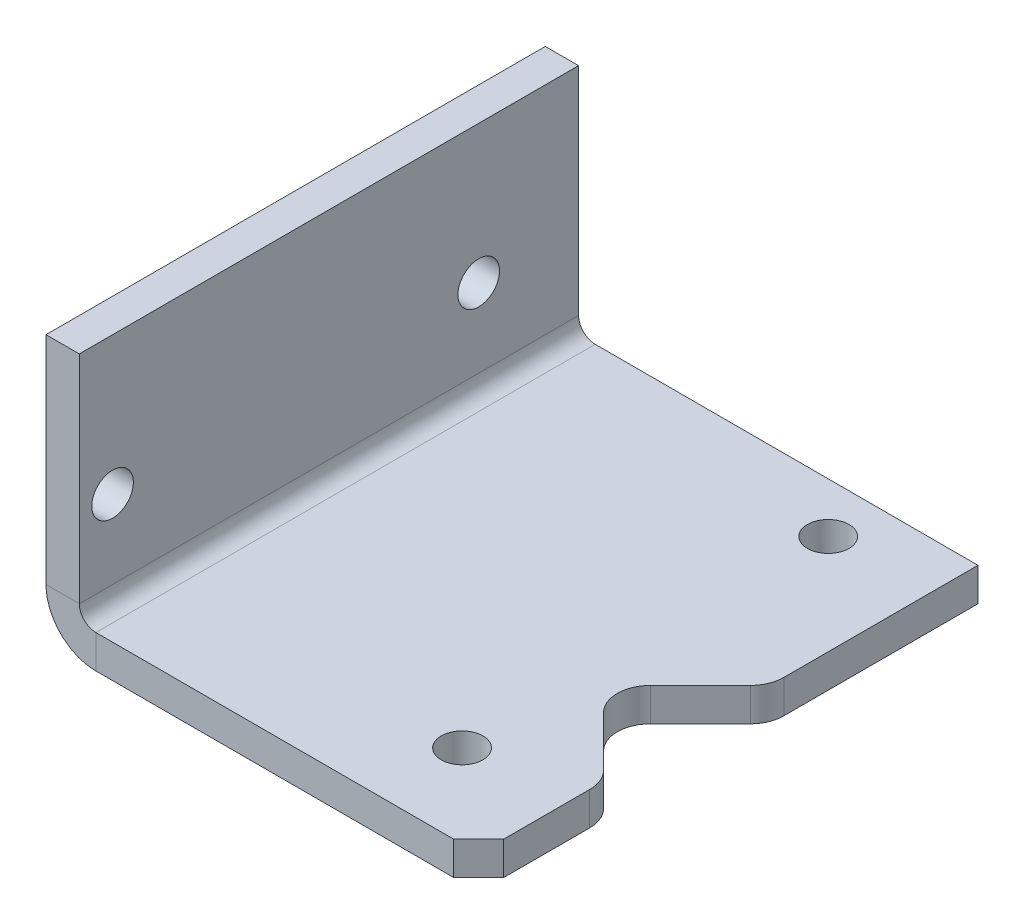
ISO-10303-21;
HEADER;
FILE_DESCRIPTION(('STEP AP214'),'2;1');
FILE_NAME('part.step','',(''),(''),'','','');
FILE_SCHEMA(('AUTOMOTIVE_DESIGN { 1 0 10303 214 1 1 1 1 }'));
ENDSEC;
DATA;
#1=APPLICATION_CONTEXT('core data for automotive mechanical design processes');
#2=APPLICATION_PROTOCOL_DEFINITION('international standard','automotive_design',2000,#1);
#3=PRODUCT_CONTEXT('',#1,'mechanical');
#4=PRODUCT('Part','Part','',(#3));
#5=PRODUCT_RELATED_PRODUCT_CATEGORY('part','',(#4));
#6=PRODUCT_DEFINITION_FORMATION('','',#4);
#7=PRODUCT_DEFINITION_CONTEXT('part definition',#1,'design');
#8=PRODUCT_DEFINITION('design','',#6,#7);
#9=PRODUCT_DEFINITION_SHAPE('','',#8);
#10=(LENGTH_UNIT() NAMED_UNIT(*) SI_UNIT(.MILLI.,.METRE.));
#11=(NAMED_UNIT(*) PLANE_ANGLE_UNIT() SI_UNIT($,.RADIAN.));
#12=(NAMED_UNIT(*) SI_UNIT($,.STERADIAN.) SOLID_ANGLE_UNIT());
#13=UNCERTAINTY_MEASURE_WITH_UNIT(LENGTH_MEASURE(1.E-05),#10,'distance_accuracy_value','');
#14=(GEOMETRIC_REPRESENTATION_CONTEXT(3) GLOBAL_UNCERTAINTY_ASSIGNED_CONTEXT((#13)) GLOBAL_UNIT_ASSIGNED_CONTEXT((#10,
#11,#12)) REPRESENTATION_CONTEXT('',''));
#15=CARTESIAN_POINT('',(0.,0.,0.));
#16=DIRECTION('',(0.,0.,1.));
#17=DIRECTION('',(1.,0.,0.));
#18=AXIS2_PLACEMENT_3D('',#15,#16,#17);
#19=CARTESIAN_POINT('',(0.,-9.,0.));
#20=DIRECTION('',(0.,1.,0.));
#21=DIRECTION('',(-1.,0.,0.));
#22=AXIS2_PLACEMENT_3D('',#19,#20,#21);
#23=PLANE('',#22);
#24=CARTESIAN_POINT('',(17.9999999999999,-9.00000000000007,10.));
#25=DIRECTION('',(0.,1.,0.));
#26=DIRECTION('',(-1.,0.,0.));
#27=AXIS2_PLACEMENT_3D('',#24,#25,#26);
#28=CIRCLE('',#27,1.25);
#29=CARTESIAN_POINT('',(16.7499999999999,-9.00000000000006,10.));
#30=VERTEX_POINT('',#29);
#31=EDGE_CURVE('E180',#30,#30,#28,.F.);
#32=ORIENTED_EDGE('',*,*,#31,.F.);
#33=EDGE_LOOP('',(#32));
#34=FACE_BOUND('',#33,.T.);
#35=CARTESIAN_POINT('',(17.9999999999999,-9.00000000000006,-12.));
#36=DIRECTION('',(0.,1.,0.));
#37=DIRECTION('',(-1.,0.,0.));
#38=AXIS2_PLACEMENT_3D('',#35,#36,#37);
#39=CIRCLE('',#38,1.25);
#40=CARTESIAN_POINT('',(16.7499999999999,-9.00000000000006,-12.));
#41=VERTEX_POINT('',#40);
#42=EDGE_CURVE('E169',#41,#41,#39,.F.);
#43=ORIENTED_EDGE('',*,*,#42,.F.);
#44=EDGE_LOOP('',(#43));
#45=FACE_BOUND('',#44,.T.);
#46=DIRECTION('',(0.,0.,1.));
#47=VECTOR('',#46,1.);
#48=CARTESIAN_POINT('',(24.,-9.00000000000009,15.));
#49=LINE('',#48,#47);
#50=CARTESIAN_POINT('',(24.,-9.00000000000008,-15.));
#51=VERTEX_POINT('',#50);
#52=CARTESIAN_POINT('',(24.,-9.00000000000008,-3.32842712474621));
#53=VERTEX_POINT('',#52);
#54=EDGE_CURVE('E211',#51,#53,#49,.T.);
#55=ORIENTED_EDGE('',*,*,#54,.T.);
#56=CARTESIAN_POINT('',(22.,-9.00000000000008,-3.32842712474621));
#57=DIRECTION('',(0.,1.,0.));
#58=DIRECTION('',(-1.,0.,0.));
#59=AXIS2_PLACEMENT_3D('',#56,#57,#58);
#60=CIRCLE('',#59,2.);
#61=CARTESIAN_POINT('',(23.4142135623731,-9.00000000000008,-1.91421356237312));
#62=VERTEX_POINT('',#61);
#63=EDGE_CURVE('E289',#53,#62,#60,.F.);
#64=ORIENTED_EDGE('',*,*,#63,.T.);
#65=DIRECTION('',(-0.707106781186546,0.,0.707106781186549));
#66=VECTOR('',#65,1.);
#67=CARTESIAN_POINT('',(10.75,-9.00000000000004,10.75));
#68=LINE('',#67,#66);
#69=CARTESIAN_POINT('',(20.4142135623731,-9.00000000000007,1.08578643762689));
#70=VERTEX_POINT('',#69);
#71=EDGE_CURVE('E332',#62,#70,#68,.T.);
#72=ORIENTED_EDGE('',*,*,#71,.T.);
#73=CARTESIAN_POINT('',(21.8284271247462,-9.00000000000008,2.49999999999997));
#74=DIRECTION('',(0.,1.,0.));
#75=DIRECTION('',(-1.,0.,0.));
#76=AXIS2_PLACEMENT_3D('',#73,#74,#75);
#77=CIRCLE('',#76,2.);
#78=CARTESIAN_POINT('',(20.4142135623731,-9.00000000000007,3.91421356237309));
#79=VERTEX_POINT('',#78);
#80=EDGE_CURVE('E335',#79,#70,#77,.F.);
#81=ORIENTED_EDGE('',*,*,#80,.F.);
#82=DIRECTION('',(-0.707106781186557,0.,-0.707106781186538));
#83=VECTOR('',#82,1.);
#84=CARTESIAN_POINT('',(8.24999999999974,-9.00000000000003,-8.24999999999998));
#85=LINE('',#84,#83);
#86=CARTESIAN_POINT('',(23.4142135623731,-9.00000000000008,6.91421356237296));
#87=VERTEX_POINT('',#86);
#88=EDGE_CURVE('E163',#87,#79,#85,.T.);
#89=ORIENTED_EDGE('',*,*,#88,.F.);
#90=CARTESIAN_POINT('',(22.,-9.00000000000008,8.32842712474607));
#91=DIRECTION('',(0.,1.,0.));
#92=DIRECTION('',(-1.,0.,0.));
#93=AXIS2_PLACEMENT_3D('',#90,#91,#92);
#94=CIRCLE('',#93,2.);
#95=CARTESIAN_POINT('',(24.,-9.00000000000009,8.32842712474607));
#96=VERTEX_POINT('',#95);
#97=EDGE_CURVE('E54',#87,#96,#94,.F.);
#98=ORIENTED_EDGE('',*,*,#97,.T.);
#99=CARTESIAN_POINT('',(24.,-9.00000000000009,13.5));
#100=VERTEX_POINT('',#99);
#101=EDGE_CURVE('E209',#96,#100,#49,.T.);
#102=ORIENTED_EDGE('',*,*,#101,.T.);
#103=DIRECTION('',(0.707106781186546,0.,-0.707106781186549));
#104=VECTOR('',#103,1.);
#105=CARTESIAN_POINT('',(22.5,-9.00000000000008,15.));
#106=LINE('',#105,#104);
#107=CARTESIAN_POINT('',(22.5,-9.00000000000008,15.));
#108=VERTEX_POINT('',#107);
#109=EDGE_CURVE('E278',#100,#108,#106,.F.);
#110=ORIENTED_EDGE('',*,*,#109,.T.);
#111=DIRECTION('',(-1.,0.,0.));
#112=VECTOR('',#111,1.);
#113=CARTESIAN_POINT('',(0.,-9.,15.));
#114=LINE('',#113,#112);
#115=CARTESIAN_POINT('',(0.99999999999999,-9.00000000000001,15.));
#116=VERTEX_POINT('',#115);
#117=EDGE_CURVE('E214',#108,#116,#114,.T.);
#118=ORIENTED_EDGE('',*,*,#117,.T.);
#119=DIRECTION('',(0.,0.,1.));
#120=VECTOR('',#119,1.);
#121=CARTESIAN_POINT('',(0.99999999999999,-9.00000000000001,0.));
#122=LINE('',#121,#120);
#123=CARTESIAN_POINT('',(0.999999999999991,-9.00000000000001,-15.));
#124=VERTEX_POINT('',#123);
#125=EDGE_CURVE('E201',#124,#116,#122,.T.);
#126=ORIENTED_EDGE('',*,*,#125,.F.);
#127=DIRECTION('',(1.,0.,0.));
#128=VECTOR('',#127,1.);
#129=CARTESIAN_POINT('',(24.,-9.00000000000008,-15.));
#130=LINE('',#129,#128);
#131=EDGE_CURVE('E207',#124,#51,#130,.T.);
#132=ORIENTED_EDGE('',*,*,#131,.T.);
#133=EDGE_LOOP('',(#55,#64,#72,#81,#89,#98,#102,#110,#118,#126,#132));
#134=FACE_BOUND('',#133,.T.);
#135=ADVANCED_FACE('F39',(#34,#45,#134),#23,.F.);
#136=CARTESIAN_POINT('',(0.,-7.,0.));
#137=DIRECTION('',(0.,1.,0.));
#138=DIRECTION('',(-1.,0.,0.));
#139=AXIS2_PLACEMENT_3D('',#136,#137,#138);
#140=PLANE('',#139);
#141=CARTESIAN_POINT('',(18.,-7.00000000000006,-12.));
#142=DIRECTION('',(0.,1.,0.));
#143=DIRECTION('',(-1.,0.,0.));
#144=AXIS2_PLACEMENT_3D('',#141,#142,#143);
#145=CIRCLE('',#144,1.25);
#146=CARTESIAN_POINT('',(16.75,-7.00000000000006,-12.));
#147=VERTEX_POINT('',#146);
#148=EDGE_CURVE('E166',#147,#147,#145,.T.);
#149=ORIENTED_EDGE('',*,*,#148,.F.);
#150=EDGE_LOOP('',(#149));
#151=FACE_BOUND('',#150,.T.);
#152=CARTESIAN_POINT('',(18.,-7.00000000000006,10.));
#153=DIRECTION('',(0.,1.,0.));
#154=DIRECTION('',(-1.,0.,0.));
#155=AXIS2_PLACEMENT_3D('',#152,#153,#154);
#156=CIRCLE('',#155,1.25);
#157=CARTESIAN_POINT('',(16.75,-7.00000000000006,10.));
#158=VERTEX_POINT('',#157);
#159=EDGE_CURVE('E177',#158,#158,#156,.T.);
#160=ORIENTED_EDGE('',*,*,#159,.F.);
#161=EDGE_LOOP('',(#160));
#162=FACE_BOUND('',#161,.T.);
#163=DIRECTION('',(-0.707106781186546,0.,0.707106781186549));
#164=VECTOR('',#163,1.);
#165=CARTESIAN_POINT('',(10.75,-7.00000000000004,10.75));
#166=LINE('',#165,#164);
#167=CARTESIAN_POINT('',(23.4142135623731,-7.00000000000008,-1.91421356237312));
#168=VERTEX_POINT('',#167);
#169=CARTESIAN_POINT('',(20.4142135623731,-7.00000000000007,1.08578643762689));
#170=VERTEX_POINT('',#169);
#171=EDGE_CURVE('E153',#168,#170,#166,.T.);
#172=ORIENTED_EDGE('',*,*,#171,.F.);
#173=CARTESIAN_POINT('',(22.,-7.00000000000008,-3.32842712474621));
#174=DIRECTION('',(0.,1.,0.));
#175=DIRECTION('',(-1.,0.,0.));
#176=AXIS2_PLACEMENT_3D('',#173,#174,#175);
#177=CIRCLE('',#176,2.);
#178=CARTESIAN_POINT('',(24.,-7.00000000000008,-3.32842712474621));
#179=VERTEX_POINT('',#178);
#180=EDGE_CURVE('E284',#168,#179,#177,.T.);
#181=ORIENTED_EDGE('',*,*,#180,.T.);
#182=DIRECTION('',(0.,0.,1.));
#183=VECTOR('',#182,1.);
#184=CARTESIAN_POINT('',(24.,-7.00000000000009,15.));
#185=LINE('',#184,#183);
#186=CARTESIAN_POINT('',(24.,-7.00000000000008,-15.));
#187=VERTEX_POINT('',#186);
#188=EDGE_CURVE('E219',#187,#179,#185,.T.);
#189=ORIENTED_EDGE('',*,*,#188,.F.);
#190=DIRECTION('',(1.,0.,0.));
#191=VECTOR('',#190,1.);
#192=CARTESIAN_POINT('',(24.,-7.00000000000008,-15.));
#193=LINE('',#192,#191);
#194=CARTESIAN_POINT('',(0.999999999999997,-7.00000000000001,-15.));
#195=VERTEX_POINT('',#194);
#196=EDGE_CURVE('E206',#195,#187,#193,.T.);
#197=ORIENTED_EDGE('',*,*,#196,.F.);
#198=DIRECTION('',(0.,0.,-1.));
#199=VECTOR('',#198,1.);
#200=CARTESIAN_POINT('',(0.999999999999997,-7.00000000000001,15.));
#201=LINE('',#200,#199);
#202=CARTESIAN_POINT('',(0.999999999999997,-7.00000000000001,15.));
#203=VERTEX_POINT('',#202);
#204=EDGE_CURVE('E196',#203,#195,#201,.T.);
#205=ORIENTED_EDGE('',*,*,#204,.F.);
#206=DIRECTION('',(-1.,0.,0.));
#207=VECTOR('',#206,1.);
#208=CARTESIAN_POINT('',(0.,-7.,15.));
#209=LINE('',#208,#207);
#210=CARTESIAN_POINT('',(22.5,-7.00000000000008,15.));
#211=VERTEX_POINT('',#210);
#212=EDGE_CURVE('E210',#211,#203,#209,.T.);
#213=ORIENTED_EDGE('',*,*,#212,.F.);
#214=DIRECTION('',(-0.707106781186546,0.,0.707106781186549));
#215=VECTOR('',#214,1.);
#216=CARTESIAN_POINT('',(18.75,-7.00000000000007,18.75));
#217=LINE('',#216,#215);
#218=CARTESIAN_POINT('',(24.,-7.00000000000009,13.5));
#219=VERTEX_POINT('',#218);
#220=EDGE_CURVE('E272',#211,#219,#217,.F.);
#221=ORIENTED_EDGE('',*,*,#220,.T.);
#222=CARTESIAN_POINT('',(24.,-7.00000000000009,8.32842712474607));
#223=VERTEX_POINT('',#222);
#224=EDGE_CURVE('E218',#223,#219,#185,.T.);
#225=ORIENTED_EDGE('',*,*,#224,.F.);
#226=CARTESIAN_POINT('',(22.,-7.00000000000008,8.32842712474607));
#227=DIRECTION('',(0.,1.,0.));
#228=DIRECTION('',(-1.,0.,0.));
#229=AXIS2_PLACEMENT_3D('',#226,#227,#228);
#230=CIRCLE('',#229,2.);
#231=CARTESIAN_POINT('',(23.4142135623731,-7.00000000000008,6.91421356237296));
#232=VERTEX_POINT('',#231);
#233=EDGE_CURVE('E150',#223,#232,#230,.T.);
#234=ORIENTED_EDGE('',*,*,#233,.T.);
#235=DIRECTION('',(-0.707106781186557,0.,-0.707106781186538));
#236=VECTOR('',#235,1.);
#237=CARTESIAN_POINT('',(8.24999999999975,-7.00000000000003,-8.24999999999998));
#238=LINE('',#237,#236);
#239=CARTESIAN_POINT('',(20.4142135623731,-7.00000000000007,3.91421356237309));
#240=VERTEX_POINT('',#239);
#241=EDGE_CURVE('E144',#232,#240,#238,.T.);
#242=ORIENTED_EDGE('',*,*,#241,.T.);
#243=CARTESIAN_POINT('',(21.8284271247462,-7.00000000000008,2.49999999999997));
#244=DIRECTION('',(0.,1.,0.));
#245=DIRECTION('',(-1.,0.,0.));
#246=AXIS2_PLACEMENT_3D('',#243,#244,#245);
#247=CIRCLE('',#246,2.);
#248=EDGE_CURVE('E148',#240,#170,#247,.F.);
#249=ORIENTED_EDGE('',*,*,#248,.T.);
#250=EDGE_LOOP('',(#172,#181,#189,#197,#205,#213,#221,#225,#234,#242,#249));
#251=FACE_BOUND('',#250,.T.);
#252=ADVANCED_FACE('F147',(#151,#162,#251),#140,.T.);
#253=CARTESIAN_POINT('',(24.,-9.00000000000009,15.));
#254=DIRECTION('',(-1.,0.,0.));
#255=DIRECTION('',(0.,-1.,0.));
#256=AXIS2_PLACEMENT_3D('',#253,#254,#255);
#257=PLANE('',#256);
#258=ORIENTED_EDGE('',*,*,#101,.F.);
#259=DIRECTION('',(0.,1.,0.));
#260=VECTOR('',#259,1.);
#261=CARTESIAN_POINT('',(24.,-7.00000000000009,8.32842712474607));
#262=LINE('',#261,#260);
#263=EDGE_CURVE('E47',#96,#223,#262,.T.);
#264=ORIENTED_EDGE('',*,*,#263,.T.);
#265=ORIENTED_EDGE('',*,*,#224,.T.);
#266=DIRECTION('',(0.,-1.,0.));
#267=VECTOR('',#266,1.);
#268=CARTESIAN_POINT('',(24.,-9.00000000000009,13.5));
#269=LINE('',#268,#267);
#270=EDGE_CURVE('E275',#219,#100,#269,.T.);
#271=ORIENTED_EDGE('',*,*,#270,.T.);
#272=EDGE_LOOP('',(#258,#264,#265,#271));
#273=FACE_BOUND('',#272,.T.);
#274=ADVANCED_FACE('F293',(#273),#257,.F.);
#275=ORIENTED_EDGE('',*,*,#188,.T.);
#276=DIRECTION('',(0.,-1.,0.));
#277=VECTOR('',#276,1.);
#278=CARTESIAN_POINT('',(24.,-9.00000000000008,-3.32842712474621));
#279=LINE('',#278,#277);
#280=EDGE_CURVE('E286',#179,#53,#279,.T.);
#281=ORIENTED_EDGE('',*,*,#280,.T.);
#282=ORIENTED_EDGE('',*,*,#54,.F.);
#283=DIRECTION('',(0.,1.,0.));
#284=VECTOR('',#283,1.);
#285=CARTESIAN_POINT('',(24.,-9.00000000000008,-15.));
#286=LINE('',#285,#284);
#287=EDGE_CURVE('E216',#51,#187,#286,.T.);
#288=ORIENTED_EDGE('',*,*,#287,.T.);
#289=EDGE_LOOP('',(#275,#281,#282,#288));
#290=FACE_BOUND('',#289,.T.);
#291=ADVANCED_FACE('F323',(#290),#257,.F.);
#292=CARTESIAN_POINT('',(-2.,-7.,-15.));
#293=DIRECTION('',(0.,0.,-1.));
#294=DIRECTION('',(-1.,0.,0.));
#295=AXIS2_PLACEMENT_3D('',#292,#293,#294);
#296=PLANE('',#295);
#297=DIRECTION('',(0.,1.,0.));
#298=VECTOR('',#297,1.);
#299=CARTESIAN_POINT('',(0.,-7.,-15.));
#300=LINE('',#299,#298);
#301=CARTESIAN_POINT('',(0.,-6.,-15.));
#302=VERTEX_POINT('',#301);
#303=CARTESIAN_POINT('',(0.,7.,-15.));
#304=VERTEX_POINT('',#303);
#305=EDGE_CURVE('E261',#302,#304,#300,.T.);
#306=ORIENTED_EDGE('',*,*,#305,.F.);
#307=DIRECTION('',(-1.,0.,0.));
#308=VECTOR('',#307,1.);
#309=CARTESIAN_POINT('',(0.,-6.,-15.));
#310=LINE('',#309,#308);
#311=CARTESIAN_POINT('',(-2.,-6.,-15.));
#312=VERTEX_POINT('',#311);
#313=EDGE_CURVE('E232',#302,#312,#310,.T.);
#314=ORIENTED_EDGE('',*,*,#313,.T.);
#315=DIRECTION('',(0.,1.,0.));
#316=VECTOR('',#315,1.);
#317=CARTESIAN_POINT('',(-2.,-7.,-15.));
#318=LINE('',#317,#316);
#319=CARTESIAN_POINT('',(-2.,7.,-15.));
#320=VERTEX_POINT('',#319);
#321=EDGE_CURVE('E252',#312,#320,#318,.T.);
#322=ORIENTED_EDGE('',*,*,#321,.T.);
#323=DIRECTION('',(1.,0.,0.));
#324=VECTOR('',#323,1.);
#325=CARTESIAN_POINT('',(-2.,7.,-15.));
#326=LINE('',#325,#324);
#327=EDGE_CURVE('E258',#320,#304,#326,.T.);
#328=ORIENTED_EDGE('',*,*,#327,.T.);
#329=EDGE_LOOP('',(#306,#314,#322,#328));
#330=FACE_BOUND('',#329,.T.);
#331=ADVANCED_FACE('F378',(#330),#296,.T.);
#332=CARTESIAN_POINT('',(-2.,0.,0.));
#333=DIRECTION('',(1.,0.,0.));
#334=DIRECTION('',(0.,0.,-1.));
#335=AXIS2_PLACEMENT_3D('',#332,#333,#334);
#336=PLANE('',#335);
#337=CARTESIAN_POINT('',(-2.,-1.3,-9.00000000000001));
#338=DIRECTION('',(1.,0.,0.));
#339=DIRECTION('',(0.,0.,-1.));
#340=AXIS2_PLACEMENT_3D('',#337,#338,#339);
#341=CIRCLE('',#340,1.25);
#342=CARTESIAN_POINT('',(-2.,-1.3,-10.25));
#343=VERTEX_POINT('',#342);
#344=EDGE_CURVE('E186',#343,#343,#341,.F.);
#345=ORIENTED_EDGE('',*,*,#344,.F.);
#346=EDGE_LOOP('',(#345));
#347=FACE_BOUND('',#346,.T.);
#348=CARTESIAN_POINT('',(-2.,-1.3,13.));
#349=DIRECTION('',(1.,0.,0.));
#350=DIRECTION('',(0.,0.,-1.));
#351=AXIS2_PLACEMENT_3D('',#348,#349,#350);
#352=CIRCLE('',#351,1.25);
#353=CARTESIAN_POINT('',(-2.,-1.3,11.75));
#354=VERTEX_POINT('',#353);
#355=EDGE_CURVE('E192',#354,#354,#352,.F.);
#356=ORIENTED_EDGE('',*,*,#355,.F.);
#357=EDGE_LOOP('',(#356));
#358=FACE_BOUND('',#357,.T.);
#359=DIRECTION('',(0.,0.,-1.));
#360=VECTOR('',#359,1.);
#361=CARTESIAN_POINT('',(-2.,-6.,-15.));
#362=LINE('',#361,#360);
#363=CARTESIAN_POINT('',(-2.,-6.,15.));
#364=VERTEX_POINT('',#363);
#365=EDGE_CURVE('E226',#312,#364,#362,.F.);
#366=ORIENTED_EDGE('',*,*,#365,.T.);
#367=DIRECTION('',(0.,-1.,0.));
#368=VECTOR('',#367,1.);
#369=CARTESIAN_POINT('',(-2.,-7.,15.));
#370=LINE('',#369,#368);
#371=CARTESIAN_POINT('',(-2.,7.,15.));
#372=VERTEX_POINT('',#371);
#373=EDGE_CURVE('E249',#372,#364,#370,.T.);
#374=ORIENTED_EDGE('',*,*,#373,.F.);
#375=DIRECTION('',(0.,0.,1.));
#376=VECTOR('',#375,1.);
#377=CARTESIAN_POINT('',(-2.,7.,-15.));
#378=LINE('',#377,#376);
#379=EDGE_CURVE('E255',#320,#372,#378,.T.);
#380=ORIENTED_EDGE('',*,*,#379,.F.);
#381=ORIENTED_EDGE('',*,*,#321,.F.);
#382=EDGE_LOOP('',(#366,#374,#380,#381));
#383=FACE_BOUND('',#382,.T.);
#384=ADVANCED_FACE('F374',(#347,#358,#383),#336,.F.);
#385=CARTESIAN_POINT('',(0.,0.,0.));
#386=DIRECTION('',(1.,0.,0.));
#387=DIRECTION('',(0.,0.,-1.));
#388=AXIS2_PLACEMENT_3D('',#385,#386,#387);
#389=PLANE('',#388);
#390=CARTESIAN_POINT('',(0.,-1.3,-9.00000000000001));
#391=DIRECTION('',(1.,0.,0.));
#392=DIRECTION('',(0.,0.,-1.));
#393=AXIS2_PLACEMENT_3D('',#390,#391,#392);
#394=CIRCLE('',#393,1.25);
#395=CARTESIAN_POINT('',(0.,-1.3,-10.25));
#396=VERTEX_POINT('',#395);
#397=EDGE_CURVE('E183',#396,#396,#394,.T.);
#398=ORIENTED_EDGE('',*,*,#397,.F.);
#399=EDGE_LOOP('',(#398));
#400=FACE_BOUND('',#399,.T.);
#401=CARTESIAN_POINT('',(0.,-1.3,13.));
#402=DIRECTION('',(1.,0.,0.));
#403=DIRECTION('',(0.,0.,-1.));
#404=AXIS2_PLACEMENT_3D('',#401,#402,#403);
#405=CIRCLE('',#404,1.25);
#406=CARTESIAN_POINT('',(0.,-1.3,11.75));
#407=VERTEX_POINT('',#406);
#408=EDGE_CURVE('E189',#407,#407,#405,.T.);
#409=ORIENTED_EDGE('',*,*,#408,.F.);
#410=EDGE_LOOP('',(#409));
#411=FACE_BOUND('',#410,.T.);
#412=DIRECTION('',(0.,-1.,0.));
#413=VECTOR('',#412,1.);
#414=CARTESIAN_POINT('',(0.,-7.,15.));
#415=LINE('',#414,#413);
#416=CARTESIAN_POINT('',(0.,7.,15.));
#417=VERTEX_POINT('',#416);
#418=CARTESIAN_POINT('',(0.,-6.,15.));
#419=VERTEX_POINT('',#418);
#420=EDGE_CURVE('E246',#417,#419,#415,.T.);
#421=ORIENTED_EDGE('',*,*,#420,.T.);
#422=DIRECTION('',(0.,0.,-1.));
#423=VECTOR('',#422,1.);
#424=CARTESIAN_POINT('',(0.,-6.,-15.));
#425=LINE('',#424,#423);
#426=EDGE_CURVE('E238',#302,#419,#425,.F.);
#427=ORIENTED_EDGE('',*,*,#426,.F.);
#428=ORIENTED_EDGE('',*,*,#305,.T.);
#429=DIRECTION('',(0.,0.,1.));
#430=VECTOR('',#429,1.);
#431=CARTESIAN_POINT('',(0.,7.,-15.));
#432=LINE('',#431,#430);
#433=EDGE_CURVE('E253',#304,#417,#432,.T.);
#434=ORIENTED_EDGE('',*,*,#433,.T.);
#435=EDGE_LOOP('',(#421,#427,#428,#434));
#436=FACE_BOUND('',#435,.T.);
#437=ADVANCED_FACE('F377',(#400,#411,#436),#389,.T.);
#438=CARTESIAN_POINT('',(-2.,-7.,15.));
#439=DIRECTION('',(0.,0.,1.));
#440=DIRECTION('',(1.,0.,0.));
#441=AXIS2_PLACEMENT_3D('',#438,#439,#440);
#442=PLANE('',#441);
#443=DIRECTION('',(-1.,0.,0.));
#444=VECTOR('',#443,1.);
#445=CARTESIAN_POINT('',(0.,-6.,15.));
#446=LINE('',#445,#444);
#447=EDGE_CURVE('E243',#419,#364,#446,.T.);
#448=ORIENTED_EDGE('',*,*,#447,.F.);
#449=ORIENTED_EDGE('',*,*,#420,.F.);
#450=DIRECTION('',(1.,0.,0.));
#451=VECTOR('',#450,1.);
#452=CARTESIAN_POINT('',(-2.,7.,15.));
#453=LINE('',#452,#451);
#454=EDGE_CURVE('E265',#372,#417,#453,.T.);
#455=ORIENTED_EDGE('',*,*,#454,.F.);
#456=ORIENTED_EDGE('',*,*,#373,.T.);
#457=EDGE_LOOP('',(#448,#449,#455,#456));
#458=FACE_BOUND('',#457,.T.);
#459=ADVANCED_FACE('F382',(#458),#442,.T.);
#460=CARTESIAN_POINT('',(-2.,7.,-15.));
#461=DIRECTION('',(0.,1.,0.));
#462=DIRECTION('',(0.,0.,1.));
#463=AXIS2_PLACEMENT_3D('',#460,#461,#462);
#464=PLANE('',#463);
#465=ORIENTED_EDGE('',*,*,#433,.F.);
#466=ORIENTED_EDGE('',*,*,#327,.F.);
#467=ORIENTED_EDGE('',*,*,#379,.T.);
#468=ORIENTED_EDGE('',*,*,#454,.T.);
#469=EDGE_LOOP('',(#465,#466,#467,#468));
#470=FACE_BOUND('',#469,.T.);
#471=ADVANCED_FACE('F370',(#470),#464,.T.);
#472=CARTESIAN_POINT('',(1.,-6.,15.));
#473=DIRECTION('',(0.,0.,1.));
#474=DIRECTION('',(1.,0.,0.));
#475=AXIS2_PLACEMENT_3D('',#472,#473,#474);
#476=PLANE('',#475);
#477=DIRECTION('',(0.,-1.,0.));
#478=VECTOR('',#477,1.);
#479=CARTESIAN_POINT('',(0.999999999999997,-7.00000000000001,15.));
#480=LINE('',#479,#478);
#481=EDGE_CURVE('E195',#203,#116,#480,.T.);
#482=ORIENTED_EDGE('',*,*,#481,.F.);
#483=CARTESIAN_POINT('',(1.,-6.,15.));
#484=DIRECTION('',(0.,0.,-1.));
#485=DIRECTION('',(-1.,0.,0.));
#486=AXIS2_PLACEMENT_3D('',#483,#484,#485);
#487=CIRCLE('',#486,1.);
#488=EDGE_CURVE('E235',#419,#203,#487,.F.);
#489=ORIENTED_EDGE('',*,*,#488,.F.);
#490=ORIENTED_EDGE('',*,*,#447,.T.);
#491=CARTESIAN_POINT('',(1.,-6.,15.));
#492=DIRECTION('',(0.,0.,-1.));
#493=DIRECTION('',(-1.,0.,0.));
#494=AXIS2_PLACEMENT_3D('',#491,#492,#493);
#495=CIRCLE('',#494,3.);
#496=EDGE_CURVE('E228',#364,#116,#495,.F.);
#497=ORIENTED_EDGE('',*,*,#496,.T.);
#498=EDGE_LOOP('',(#482,#489,#490,#497));
#499=FACE_BOUND('',#498,.T.);
#500=ADVANCED_FACE('F309',(#499),#476,.T.);
#501=CARTESIAN_POINT('',(1.,-6.,-15.));
#502=DIRECTION('',(0.,0.,1.));
#503=DIRECTION('',(1.,0.,0.));
#504=AXIS2_PLACEMENT_3D('',#501,#502,#503);
#505=PLANE('',#504);
#506=CARTESIAN_POINT('',(1.,-6.,-15.));
#507=DIRECTION('',(0.,0.,-1.));
#508=DIRECTION('',(-1.,0.,0.));
#509=AXIS2_PLACEMENT_3D('',#506,#507,#508);
#510=CIRCLE('',#509,1.);
#511=EDGE_CURVE('E225',#195,#302,#510,.T.);
#512=ORIENTED_EDGE('',*,*,#511,.F.);
#513=DIRECTION('',(0.,-1.,0.));
#514=VECTOR('',#513,1.);
#515=CARTESIAN_POINT('',(0.999999999999998,-7.,-15.));
#516=LINE('',#515,#514);
#517=EDGE_CURVE('E198',#195,#124,#516,.T.);
#518=ORIENTED_EDGE('',*,*,#517,.T.);
#519=CARTESIAN_POINT('',(1.,-6.,-15.));
#520=DIRECTION('',(0.,0.,-1.));
#521=DIRECTION('',(-1.,0.,0.));
#522=AXIS2_PLACEMENT_3D('',#519,#520,#521);
#523=CIRCLE('',#522,3.);
#524=EDGE_CURVE('E229',#124,#312,#523,.T.);
#525=ORIENTED_EDGE('',*,*,#524,.T.);
#526=ORIENTED_EDGE('',*,*,#313,.F.);
#527=EDGE_LOOP('',(#512,#518,#525,#526));
#528=FACE_BOUND('',#527,.T.);
#529=ADVANCED_FACE('F364',(#528),#505,.F.);
#530=CARTESIAN_POINT('',(1.,-6.,-15.));
#531=DIRECTION('',(0.,0.,-1.));
#532=DIRECTION('',(0.,-1.,0.));
#533=AXIS2_PLACEMENT_3D('',#530,#531,#532);
#534=CYLINDRICAL_SURFACE('',#533,3.);
#535=ORIENTED_EDGE('',*,*,#365,.F.);
#536=ORIENTED_EDGE('',*,*,#524,.F.);
#537=ORIENTED_EDGE('',*,*,#125,.T.);
#538=ORIENTED_EDGE('',*,*,#496,.F.);
#539=EDGE_LOOP('',(#535,#536,#537,#538));
#540=FACE_BOUND('',#539,.T.);
#541=ADVANCED_FACE('F361',(#540),#534,.T.);
#542=CARTESIAN_POINT('',(1.,-6.,-15.));
#543=DIRECTION('',(0.,0.,-1.));
#544=DIRECTION('',(0.,-1.,0.));
#545=AXIS2_PLACEMENT_3D('',#542,#543,#544);
#546=CYLINDRICAL_SURFACE('',#545,1.);
#547=ORIENTED_EDGE('',*,*,#426,.T.);
#548=ORIENTED_EDGE('',*,*,#488,.T.);
#549=ORIENTED_EDGE('',*,*,#204,.T.);
#550=ORIENTED_EDGE('',*,*,#511,.T.);
#551=EDGE_LOOP('',(#547,#548,#549,#550));
#552=FACE_BOUND('',#551,.T.);
#553=ADVANCED_FACE('F312',(#552),#546,.F.);
#554=CARTESIAN_POINT('',(24.,-9.00000000000008,-15.));
#555=DIRECTION('',(0.,0.,1.));
#556=DIRECTION('',(1.,0.,0.));
#557=AXIS2_PLACEMENT_3D('',#554,#555,#556);
#558=PLANE('',#557);
#559=ORIENTED_EDGE('',*,*,#517,.F.);
#560=ORIENTED_EDGE('',*,*,#196,.T.);
#561=ORIENTED_EDGE('',*,*,#287,.F.);
#562=ORIENTED_EDGE('',*,*,#131,.F.);
#563=EDGE_LOOP('',(#559,#560,#561,#562));
#564=FACE_BOUND('',#563,.T.);
#565=ADVANCED_FACE('F319',(#564),#558,.F.);
#566=CARTESIAN_POINT('',(0.,-9.,15.));
#567=DIRECTION('',(0.,0.,-1.));
#568=DIRECTION('',(-1.,0.,0.));
#569=AXIS2_PLACEMENT_3D('',#566,#567,#568);
#570=PLANE('',#569);
#571=ORIENTED_EDGE('',*,*,#117,.F.);
#572=DIRECTION('',(0.,1.,0.));
#573=VECTOR('',#572,1.);
#574=CARTESIAN_POINT('',(22.5,-9.00000000000008,15.));
#575=LINE('',#574,#573);
#576=EDGE_CURVE('E267',#108,#211,#575,.T.);
#577=ORIENTED_EDGE('',*,*,#576,.T.);
#578=ORIENTED_EDGE('',*,*,#212,.T.);
#579=ORIENTED_EDGE('',*,*,#481,.T.);
#580=EDGE_LOOP('',(#571,#577,#578,#579));
#581=FACE_BOUND('',#580,.T.);
#582=ADVANCED_FACE('F305',(#581),#570,.F.);
#583=CARTESIAN_POINT('',(-5.53553390593274,-1.3,13.));
#584=DIRECTION('',(1.,0.,0.));
#585=DIRECTION('',(0.,0.,-1.));
#586=AXIS2_PLACEMENT_3D('',#583,#584,#585);
#587=CYLINDRICAL_SURFACE('',#586,1.25);
#588=ORIENTED_EDGE('',*,*,#355,.T.);
#589=EDGE_LOOP('',(#588));
#590=FACE_BOUND('',#589,.T.);
#591=ORIENTED_EDGE('',*,*,#408,.T.);
#592=EDGE_LOOP('',(#591));
#593=FACE_BOUND('',#592,.T.);
#594=ADVANCED_FACE('F352',(#590,#593),#587,.F.);
#595=CARTESIAN_POINT('',(-5.53553390593274,-1.3,-9.00000000000001));
#596=DIRECTION('',(1.,0.,0.));
#597=DIRECTION('',(0.,0.,-1.));
#598=AXIS2_PLACEMENT_3D('',#595,#596,#597);
#599=CYLINDRICAL_SURFACE('',#598,1.25);
#600=ORIENTED_EDGE('',*,*,#344,.T.);
#601=EDGE_LOOP('',(#600));
#602=FACE_BOUND('',#601,.T.);
#603=ORIENTED_EDGE('',*,*,#397,.T.);
#604=EDGE_LOOP('',(#603));
#605=FACE_BOUND('',#604,.T.);
#606=ADVANCED_FACE('F407',(#602,#605),#599,.F.);
#607=CARTESIAN_POINT('',(17.9999999999999,-12.5355339059328,10.));
#608=DIRECTION('',(0.,1.,0.));
#609=DIRECTION('',(-1.,0.,0.));
#610=AXIS2_PLACEMENT_3D('',#607,#608,#609);
#611=CYLINDRICAL_SURFACE('',#610,1.25);
#612=ORIENTED_EDGE('',*,*,#31,.T.);
#613=EDGE_LOOP('',(#612));
#614=FACE_BOUND('',#613,.T.);
#615=ORIENTED_EDGE('',*,*,#159,.T.);
#616=EDGE_LOOP('',(#615));
#617=FACE_BOUND('',#616,.T.);
#618=ADVANCED_FACE('F401',(#614,#617),#611,.F.);
#619=CARTESIAN_POINT('',(17.9999999999999,-12.5355339059328,-12.));
#620=DIRECTION('',(0.,1.,0.));
#621=DIRECTION('',(-1.,0.,0.));
#622=AXIS2_PLACEMENT_3D('',#619,#620,#621);
#623=CYLINDRICAL_SURFACE('',#622,1.25);
#624=ORIENTED_EDGE('',*,*,#42,.T.);
#625=EDGE_LOOP('',(#624));
#626=FACE_BOUND('',#625,.T.);
#627=ORIENTED_EDGE('',*,*,#148,.T.);
#628=EDGE_LOOP('',(#627));
#629=FACE_BOUND('',#628,.T.);
#630=ADVANCED_FACE('F394',(#626,#629),#623,.F.);
#631=CARTESIAN_POINT('',(22.5,-9.00000000000008,15.));
#632=DIRECTION('',(-0.707106781186549,0.,-0.707106781186546));
#633=DIRECTION('',(0.,1.,0.));
#634=AXIS2_PLACEMENT_3D('',#631,#632,#633);
#635=PLANE('',#634);
#636=ORIENTED_EDGE('',*,*,#109,.F.);
#637=ORIENTED_EDGE('',*,*,#270,.F.);
#638=ORIENTED_EDGE('',*,*,#220,.F.);
#639=ORIENTED_EDGE('',*,*,#576,.F.);
#640=EDGE_LOOP('',(#636,#637,#638,#639));
#641=FACE_BOUND('',#640,.T.);
#642=ADVANCED_FACE('F301',(#641),#635,.F.);
#643=CARTESIAN_POINT('',(8.24999999999974,-9.00000000000003,-8.24999999999998));
#644=DIRECTION('',(0.707106781186538,0.,-0.707106781186557));
#645=DIRECTION('',(-0.707106781186557,0.,-0.707106781186538));
#646=AXIS2_PLACEMENT_3D('',#643,#644,#645);
#647=PLANE('',#646);
#648=ORIENTED_EDGE('',*,*,#241,.F.);
#649=DIRECTION('',(0.,1.,0.));
#650=VECTOR('',#649,1.);
#651=CARTESIAN_POINT('',(23.4142135623731,-9.00000000000008,6.91421356237296));
#652=LINE('',#651,#650);
#653=EDGE_CURVE('E12',#232,#87,#652,.F.);
#654=ORIENTED_EDGE('',*,*,#653,.T.);
#655=ORIENTED_EDGE('',*,*,#88,.T.);
#656=DIRECTION('',(0.,-1.,0.));
#657=VECTOR('',#656,1.);
#658=CARTESIAN_POINT('',(20.4142135623731,-9.00000000000007,3.91421356237309));
#659=LINE('',#658,#657);
#660=EDGE_CURVE('E160',#79,#240,#659,.F.);
#661=ORIENTED_EDGE('',*,*,#660,.T.);
#662=EDGE_LOOP('',(#648,#654,#655,#661));
#663=FACE_BOUND('',#662,.T.);
#664=ADVANCED_FACE('F165',(#663),#647,.T.);
#665=CARTESIAN_POINT('',(21.8284271247462,-9.00000000000008,2.49999999999997));
#666=DIRECTION('',(0.,1.,0.));
#667=DIRECTION('',(-1.,0.,0.));
#668=AXIS2_PLACEMENT_3D('',#665,#666,#667);
#669=CYLINDRICAL_SURFACE('',#668,2.);
#670=ORIENTED_EDGE('',*,*,#660,.F.);
#671=ORIENTED_EDGE('',*,*,#80,.T.);
#672=DIRECTION('',(0.,-1.,0.));
#673=VECTOR('',#672,1.);
#674=CARTESIAN_POINT('',(20.4142135623731,-9.00000000000007,1.08578643762689));
#675=LINE('',#674,#673);
#676=EDGE_CURVE('E152',#70,#170,#675,.F.);
#677=ORIENTED_EDGE('',*,*,#676,.T.);
#678=ORIENTED_EDGE('',*,*,#248,.F.);
#679=EDGE_LOOP('',(#670,#671,#677,#678));
#680=FACE_BOUND('',#679,.T.);
#681=ADVANCED_FACE('F158',(#680),#669,.F.);
#682=CARTESIAN_POINT('',(10.75,-9.00000000000004,10.75));
#683=DIRECTION('',(-0.707106781186549,0.,-0.707106781186546));
#684=DIRECTION('',(-0.707106781186546,0.,0.707106781186549));
#685=AXIS2_PLACEMENT_3D('',#682,#683,#684);
#686=PLANE('',#685);
#687=ORIENTED_EDGE('',*,*,#71,.F.);
#688=DIRECTION('',(0.,1.,0.));
#689=VECTOR('',#688,1.);
#690=CARTESIAN_POINT('',(23.4142135623731,-7.00000000000008,-1.91421356237312));
#691=LINE('',#690,#689);
#692=EDGE_CURVE('E280',#62,#168,#691,.T.);
#693=ORIENTED_EDGE('',*,*,#692,.T.);
#694=ORIENTED_EDGE('',*,*,#171,.T.);
#695=ORIENTED_EDGE('',*,*,#676,.F.);
#696=EDGE_LOOP('',(#687,#693,#694,#695));
#697=FACE_BOUND('',#696,.T.);
#698=ADVANCED_FACE('F331',(#697),#686,.F.);
#699=CARTESIAN_POINT('',(22.,-9.00000000000008,-3.32842712474621));
#700=DIRECTION('',(0.,1.,0.));
#701=DIRECTION('',(-1.,0.,0.));
#702=AXIS2_PLACEMENT_3D('',#699,#700,#701);
#703=CYLINDRICAL_SURFACE('',#702,2.);
#704=ORIENTED_EDGE('',*,*,#63,.F.);
#705=ORIENTED_EDGE('',*,*,#280,.F.);
#706=ORIENTED_EDGE('',*,*,#180,.F.);
#707=ORIENTED_EDGE('',*,*,#692,.F.);
#708=EDGE_LOOP('',(#704,#705,#706,#707));
#709=FACE_BOUND('',#708,.T.);
#710=ADVANCED_FACE('F329',(#709),#703,.T.);
#711=CARTESIAN_POINT('',(22.,-9.00000000000008,8.32842712474607));
#712=DIRECTION('',(0.,-1.,0.));
#713=DIRECTION('',(1.,0.,0.));
#714=AXIS2_PLACEMENT_3D('',#711,#712,#713);
#715=CYLINDRICAL_SURFACE('',#714,2.);
#716=ORIENTED_EDGE('',*,*,#97,.F.);
#717=ORIENTED_EDGE('',*,*,#653,.F.);
#718=ORIENTED_EDGE('',*,*,#233,.F.);
#719=ORIENTED_EDGE('',*,*,#263,.F.);
#720=EDGE_LOOP('',(#716,#717,#718,#719));
#721=FACE_BOUND('',#720,.T.);
#722=ADVANCED_FACE('F41',(#721),#715,.T.);
#723=CLOSED_SHELL('',(#135,#252,#274,#291,#331,#384,#437,#459,#471,#500,#529,#541,#553,#565,
#582,#594,#606,#618,#630,#642,#664,#681,#698,#710,#722));
#724=MANIFOLD_SOLID_BREP('B2',#723);
#725=ADVANCED_BREP_SHAPE_REPRESENTATION('',(#18,#724),#14);
#726=SHAPE_DEFINITION_REPRESENTATION(#9,#725);
ENDSEC;
END-ISO-10303-21;
